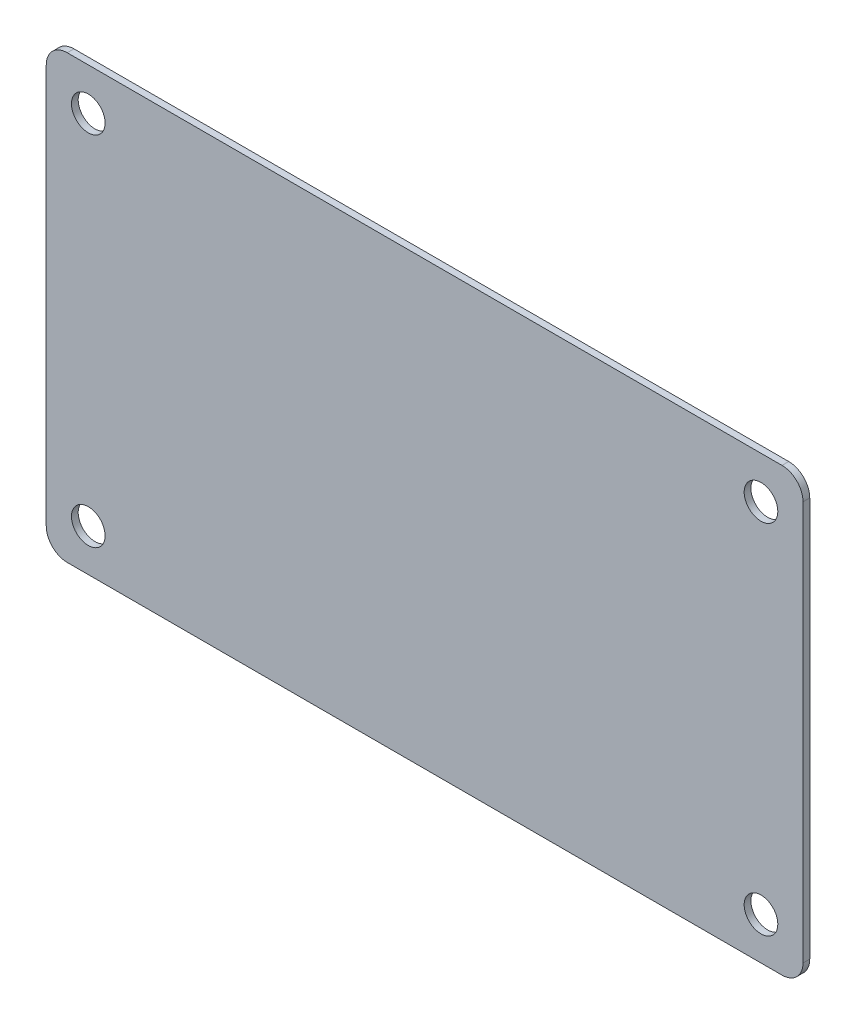
ISO-10303-21;
HEADER;
FILE_DESCRIPTION(('STEP AP214'),'2;1');
FILE_NAME('part.step','',(''),(''),'','','');
FILE_SCHEMA(('AUTOMOTIVE_DESIGN { 1 0 10303 214 1 1 1 1 }'));
ENDSEC;
DATA;
#1=APPLICATION_CONTEXT('core data for automotive mechanical design processes');
#2=APPLICATION_PROTOCOL_DEFINITION('international standard','automotive_design',2000,#1);
#3=PRODUCT_CONTEXT('',#1,'mechanical');
#4=PRODUCT('Part','Part','',(#3));
#5=PRODUCT_RELATED_PRODUCT_CATEGORY('part','',(#4));
#6=PRODUCT_DEFINITION_FORMATION('','',#4);
#7=PRODUCT_DEFINITION_CONTEXT('part definition',#1,'design');
#8=PRODUCT_DEFINITION('design','',#6,#7);
#9=PRODUCT_DEFINITION_SHAPE('','',#8);
#10=(LENGTH_UNIT() NAMED_UNIT(*) SI_UNIT(.MILLI.,.METRE.));
#11=(NAMED_UNIT(*) PLANE_ANGLE_UNIT() SI_UNIT($,.RADIAN.));
#12=(NAMED_UNIT(*) SI_UNIT($,.STERADIAN.) SOLID_ANGLE_UNIT());
#13=UNCERTAINTY_MEASURE_WITH_UNIT(LENGTH_MEASURE(1.E-05),#10,'distance_accuracy_value','');
#14=(GEOMETRIC_REPRESENTATION_CONTEXT(3) GLOBAL_UNCERTAINTY_ASSIGNED_CONTEXT((#13)) GLOBAL_UNIT_ASSIGNED_CONTEXT((#10,
#11,#12)) REPRESENTATION_CONTEXT('',''));
#15=CARTESIAN_POINT('',(0.,0.,0.));
#16=DIRECTION('',(0.,0.,1.));
#17=DIRECTION('',(1.,0.,0.));
#18=AXIS2_PLACEMENT_3D('',#15,#16,#17);
#19=CARTESIAN_POINT('',(5.,100.,1.6));
#20=DIRECTION('',(0.,0.,-1.));
#21=DIRECTION('',(-1.,0.,0.));
#22=AXIS2_PLACEMENT_3D('',#19,#20,#21);
#23=CYLINDRICAL_SURFACE('',#22,5.);
#24=CARTESIAN_POINT('',(5.,100.,0.));
#25=DIRECTION('',(0.,0.,1.));
#26=DIRECTION('',(-1.,0.,0.));
#27=AXIS2_PLACEMENT_3D('',#24,#25,#26);
#28=CIRCLE('',#27,5.);
#29=CARTESIAN_POINT('',(5.00000000000003,105.,0.));
#30=VERTEX_POINT('',#29);
#31=CARTESIAN_POINT('',(0.,100.,0.));
#32=VERTEX_POINT('',#31);
#33=EDGE_CURVE('E137',#30,#32,#28,.T.);
#34=ORIENTED_EDGE('',*,*,#33,.T.);
#35=DIRECTION('',(0.,0.,-1.));
#36=VECTOR('',#35,1.);
#37=CARTESIAN_POINT('',(0.,100.,1.6));
#38=LINE('',#37,#36);
#39=CARTESIAN_POINT('',(0.,100.,1.6));
#40=VERTEX_POINT('',#39);
#41=EDGE_CURVE('E11',#40,#32,#38,.T.);
#42=ORIENTED_EDGE('',*,*,#41,.F.);
#43=CARTESIAN_POINT('',(5.,100.,1.6));
#44=DIRECTION('',(0.,0.,1.));
#45=DIRECTION('',(-1.,0.,0.));
#46=AXIS2_PLACEMENT_3D('',#43,#44,#45);
#47=CIRCLE('',#46,5.);
#48=CARTESIAN_POINT('',(5.00000000000003,105.,1.6));
#49=VERTEX_POINT('',#48);
#50=EDGE_CURVE('E151',#49,#40,#47,.T.);
#51=ORIENTED_EDGE('',*,*,#50,.F.);
#52=DIRECTION('',(0.,0.,-1.));
#53=VECTOR('',#52,1.);
#54=CARTESIAN_POINT('',(5.00000000000003,105.,1.6));
#55=LINE('',#54,#53);
#56=EDGE_CURVE('E133',#49,#30,#55,.T.);
#57=ORIENTED_EDGE('',*,*,#56,.T.);
#58=EDGE_LOOP('',(#34,#42,#51,#57));
#59=FACE_BOUND('',#58,.T.);
#60=ADVANCED_FACE('F39',(#59),#23,.T.);
#61=CARTESIAN_POINT('',(0.,5.00000000000004,1.6));
#62=DIRECTION('',(1.,0.,0.));
#63=DIRECTION('',(0.,0.,-1.));
#64=AXIS2_PLACEMENT_3D('',#61,#62,#63);
#65=PLANE('',#64);
#66=DIRECTION('',(0.,-1.,0.));
#67=VECTOR('',#66,1.);
#68=CARTESIAN_POINT('',(0.,5.00000000000004,0.));
#69=LINE('',#68,#67);
#70=CARTESIAN_POINT('',(0.,5.00000000000004,0.));
#71=VERTEX_POINT('',#70);
#72=EDGE_CURVE('E140',#32,#71,#69,.T.);
#73=ORIENTED_EDGE('',*,*,#72,.T.);
#74=DIRECTION('',(0.,0.,-1.));
#75=VECTOR('',#74,1.);
#76=CARTESIAN_POINT('',(0.,5.00000000000004,1.6));
#77=LINE('',#76,#75);
#78=CARTESIAN_POINT('',(0.,5.00000000000004,1.6));
#79=VERTEX_POINT('',#78);
#80=EDGE_CURVE('E48',#79,#71,#77,.T.);
#81=ORIENTED_EDGE('',*,*,#80,.F.);
#82=DIRECTION('',(0.,-1.,0.));
#83=VECTOR('',#82,1.);
#84=CARTESIAN_POINT('',(0.,5.00000000000004,1.6));
#85=LINE('',#84,#83);
#86=EDGE_CURVE('E100',#40,#79,#85,.T.);
#87=ORIENTED_EDGE('',*,*,#86,.F.);
#88=ORIENTED_EDGE('',*,*,#41,.T.);
#89=EDGE_LOOP('',(#73,#81,#87,#88));
#90=FACE_BOUND('',#89,.T.);
#91=ADVANCED_FACE('F205',(#90),#65,.F.);
#92=CARTESIAN_POINT('',(5.,5.,1.6));
#93=DIRECTION('',(0.,0.,-1.));
#94=DIRECTION('',(-1.,0.,0.));
#95=AXIS2_PLACEMENT_3D('',#92,#93,#94);
#96=CYLINDRICAL_SURFACE('',#95,5.);
#97=CARTESIAN_POINT('',(5.,5.,0.));
#98=DIRECTION('',(0.,0.,1.));
#99=DIRECTION('',(-1.,0.,0.));
#100=AXIS2_PLACEMENT_3D('',#97,#98,#99);
#101=CIRCLE('',#100,5.);
#102=CARTESIAN_POINT('',(5.00000000000004,0.,0.));
#103=VERTEX_POINT('',#102);
#104=EDGE_CURVE('E142',#71,#103,#101,.T.);
#105=ORIENTED_EDGE('',*,*,#104,.T.);
#106=DIRECTION('',(0.,0.,-1.));
#107=VECTOR('',#106,1.);
#108=CARTESIAN_POINT('',(5.00000000000004,0.,1.6));
#109=LINE('',#108,#107);
#110=CARTESIAN_POINT('',(5.00000000000004,0.,1.6));
#111=VERTEX_POINT('',#110);
#112=EDGE_CURVE('E158',#111,#103,#109,.T.);
#113=ORIENTED_EDGE('',*,*,#112,.F.);
#114=CARTESIAN_POINT('',(5.,5.,1.6));
#115=DIRECTION('',(0.,0.,1.));
#116=DIRECTION('',(-1.,0.,0.));
#117=AXIS2_PLACEMENT_3D('',#114,#115,#116);
#118=CIRCLE('',#117,5.);
#119=EDGE_CURVE('E360',#79,#111,#118,.T.);
#120=ORIENTED_EDGE('',*,*,#119,.F.);
#121=ORIENTED_EDGE('',*,*,#80,.T.);
#122=EDGE_LOOP('',(#105,#113,#120,#121));
#123=FACE_BOUND('',#122,.T.);
#124=ADVANCED_FACE('F209',(#123),#96,.T.);
#125=CARTESIAN_POINT('',(5.00000000000004,0.,1.6));
#126=DIRECTION('',(0.,1.,0.));
#127=DIRECTION('',(0.,0.,1.));
#128=AXIS2_PLACEMENT_3D('',#125,#126,#127);
#129=PLANE('',#128);
#130=DIRECTION('',(1.,0.,0.));
#131=VECTOR('',#130,1.);
#132=CARTESIAN_POINT('',(5.00000000000004,0.,0.));
#133=LINE('',#132,#131);
#134=CARTESIAN_POINT('',(175.,0.,0.));
#135=VERTEX_POINT('',#134);
#136=EDGE_CURVE('E144',#103,#135,#133,.T.);
#137=ORIENTED_EDGE('',*,*,#136,.T.);
#138=DIRECTION('',(0.,0.,-1.));
#139=VECTOR('',#138,1.);
#140=CARTESIAN_POINT('',(175.,0.,1.6));
#141=LINE('',#140,#139);
#142=CARTESIAN_POINT('',(175.,0.,1.6));
#143=VERTEX_POINT('',#142);
#144=EDGE_CURVE('E155',#143,#135,#141,.T.);
#145=ORIENTED_EDGE('',*,*,#144,.F.);
#146=DIRECTION('',(1.,0.,0.));
#147=VECTOR('',#146,1.);
#148=CARTESIAN_POINT('',(5.00000000000004,0.,1.6));
#149=LINE('',#148,#147);
#150=EDGE_CURVE('E362',#111,#143,#149,.T.);
#151=ORIENTED_EDGE('',*,*,#150,.F.);
#152=ORIENTED_EDGE('',*,*,#112,.T.);
#153=EDGE_LOOP('',(#137,#145,#151,#152));
#154=FACE_BOUND('',#153,.T.);
#155=ADVANCED_FACE('F213',(#154),#129,.F.);
#156=CARTESIAN_POINT('',(175.,5.,1.6));
#157=DIRECTION('',(0.,0.,-1.));
#158=DIRECTION('',(-1.,0.,0.));
#159=AXIS2_PLACEMENT_3D('',#156,#157,#158);
#160=CYLINDRICAL_SURFACE('',#159,5.);
#161=CARTESIAN_POINT('',(175.,5.,0.));
#162=DIRECTION('',(0.,0.,1.));
#163=DIRECTION('',(1.,0.,0.));
#164=AXIS2_PLACEMENT_3D('',#161,#162,#163);
#165=CIRCLE('',#164,5.);
#166=CARTESIAN_POINT('',(180.,5.,0.));
#167=VERTEX_POINT('',#166);
#168=EDGE_CURVE('E146',#135,#167,#165,.T.);
#169=ORIENTED_EDGE('',*,*,#168,.T.);
#170=DIRECTION('',(0.,0.,-1.));
#171=VECTOR('',#170,1.);
#172=CARTESIAN_POINT('',(180.,5.,1.6));
#173=LINE('',#172,#171);
#174=CARTESIAN_POINT('',(180.,5.,1.6));
#175=VERTEX_POINT('',#174);
#176=EDGE_CURVE('E128',#175,#167,#173,.T.);
#177=ORIENTED_EDGE('',*,*,#176,.F.);
#178=CARTESIAN_POINT('',(175.,5.,1.6));
#179=DIRECTION('',(0.,0.,1.));
#180=DIRECTION('',(1.,0.,0.));
#181=AXIS2_PLACEMENT_3D('',#178,#179,#180);
#182=CIRCLE('',#181,5.);
#183=EDGE_CURVE('E119',#143,#175,#182,.T.);
#184=ORIENTED_EDGE('',*,*,#183,.F.);
#185=ORIENTED_EDGE('',*,*,#144,.T.);
#186=EDGE_LOOP('',(#169,#177,#184,#185));
#187=FACE_BOUND('',#186,.T.);
#188=ADVANCED_FACE('F219',(#187),#160,.T.);
#189=CARTESIAN_POINT('',(180.,5.00000000000004,1.6));
#190=DIRECTION('',(-1.,0.,0.));
#191=DIRECTION('',(0.,0.,1.));
#192=AXIS2_PLACEMENT_3D('',#189,#190,#191);
#193=PLANE('',#192);
#194=DIRECTION('',(0.,1.,0.));
#195=VECTOR('',#194,1.);
#196=CARTESIAN_POINT('',(180.,5.00000000000004,0.));
#197=LINE('',#196,#195);
#198=CARTESIAN_POINT('',(180.,100.,0.));
#199=VERTEX_POINT('',#198);
#200=EDGE_CURVE('E127',#167,#199,#197,.T.);
#201=ORIENTED_EDGE('',*,*,#200,.T.);
#202=DIRECTION('',(0.,0.,-1.));
#203=VECTOR('',#202,1.);
#204=CARTESIAN_POINT('',(180.,100.,1.6));
#205=LINE('',#204,#203);
#206=CARTESIAN_POINT('',(180.,100.,1.6));
#207=VERTEX_POINT('',#206);
#208=EDGE_CURVE('E124',#207,#199,#205,.T.);
#209=ORIENTED_EDGE('',*,*,#208,.F.);
#210=DIRECTION('',(0.,1.,0.));
#211=VECTOR('',#210,1.);
#212=CARTESIAN_POINT('',(180.,5.00000000000004,1.6));
#213=LINE('',#212,#211);
#214=EDGE_CURVE('E113',#175,#207,#213,.T.);
#215=ORIENTED_EDGE('',*,*,#214,.F.);
#216=ORIENTED_EDGE('',*,*,#176,.T.);
#217=EDGE_LOOP('',(#201,#209,#215,#216));
#218=FACE_BOUND('',#217,.T.);
#219=ADVANCED_FACE('F125',(#218),#193,.F.);
#220=CARTESIAN_POINT('',(175.,100.,1.6));
#221=DIRECTION('',(0.,0.,-1.));
#222=DIRECTION('',(-1.,0.,0.));
#223=AXIS2_PLACEMENT_3D('',#220,#221,#222);
#224=CYLINDRICAL_SURFACE('',#223,5.);
#225=CARTESIAN_POINT('',(175.,100.,0.));
#226=DIRECTION('',(0.,0.,1.));
#227=DIRECTION('',(-1.,0.,0.));
#228=AXIS2_PLACEMENT_3D('',#225,#226,#227);
#229=CIRCLE('',#228,5.);
#230=CARTESIAN_POINT('',(175.,105.,0.));
#231=VERTEX_POINT('',#230);
#232=EDGE_CURVE('E86',#199,#231,#229,.T.);
#233=ORIENTED_EDGE('',*,*,#232,.T.);
#234=DIRECTION('',(0.,0.,-1.));
#235=VECTOR('',#234,1.);
#236=CARTESIAN_POINT('',(175.,105.,1.6));
#237=LINE('',#236,#235);
#238=CARTESIAN_POINT('',(175.,105.,1.6));
#239=VERTEX_POINT('',#238);
#240=EDGE_CURVE('E129',#239,#231,#237,.T.);
#241=ORIENTED_EDGE('',*,*,#240,.F.);
#242=CARTESIAN_POINT('',(175.,100.,1.6));
#243=DIRECTION('',(0.,0.,1.));
#244=DIRECTION('',(-1.,0.,0.));
#245=AXIS2_PLACEMENT_3D('',#242,#243,#244);
#246=CIRCLE('',#245,5.);
#247=EDGE_CURVE('E117',#207,#239,#246,.T.);
#248=ORIENTED_EDGE('',*,*,#247,.F.);
#249=ORIENTED_EDGE('',*,*,#208,.T.);
#250=EDGE_LOOP('',(#233,#241,#248,#249));
#251=FACE_BOUND('',#250,.T.);
#252=ADVANCED_FACE('F131',(#251),#224,.T.);
#253=CARTESIAN_POINT('',(5.00000000000003,105.,1.6));
#254=DIRECTION('',(0.,-1.,0.));
#255=DIRECTION('',(0.,0.,-1.));
#256=AXIS2_PLACEMENT_3D('',#253,#254,#255);
#257=PLANE('',#256);
#258=DIRECTION('',(-1.,0.,0.));
#259=VECTOR('',#258,1.);
#260=CARTESIAN_POINT('',(5.00000000000003,105.,0.));
#261=LINE('',#260,#259);
#262=EDGE_CURVE('E92',#231,#30,#261,.T.);
#263=ORIENTED_EDGE('',*,*,#262,.T.);
#264=ORIENTED_EDGE('',*,*,#56,.F.);
#265=DIRECTION('',(-1.,0.,0.));
#266=VECTOR('',#265,1.);
#267=CARTESIAN_POINT('',(5.00000000000003,105.,1.6));
#268=LINE('',#267,#266);
#269=EDGE_CURVE('E57',#239,#49,#268,.T.);
#270=ORIENTED_EDGE('',*,*,#269,.F.);
#271=ORIENTED_EDGE('',*,*,#240,.T.);
#272=EDGE_LOOP('',(#263,#264,#270,#271));
#273=FACE_BOUND('',#272,.T.);
#274=ADVANCED_FACE('F194',(#273),#257,.F.);
#275=CARTESIAN_POINT('',(5.,100.,1.6));
#276=DIRECTION('',(0.,0.,-1.));
#277=DIRECTION('',(-1.,0.,0.));
#278=AXIS2_PLACEMENT_3D('',#275,#276,#277);
#279=PLANE('',#278);
#280=CARTESIAN_POINT('',(10.,95.,1.6));
#281=DIRECTION('',(0.,0.,1.));
#282=DIRECTION('',(1.,0.,0.));
#283=AXIS2_PLACEMENT_3D('',#280,#281,#282);
#284=CIRCLE('',#283,4.);
#285=CARTESIAN_POINT('',(14.,95.,1.6));
#286=VERTEX_POINT('',#285);
#287=EDGE_CURVE('E348',#286,#286,#284,.T.);
#288=ORIENTED_EDGE('',*,*,#287,.F.);
#289=EDGE_LOOP('',(#288));
#290=FACE_BOUND('',#289,.T.);
#291=CARTESIAN_POINT('',(170.,10.,1.6));
#292=DIRECTION('',(0.,0.,1.));
#293=DIRECTION('',(1.,0.,0.));
#294=AXIS2_PLACEMENT_3D('',#291,#292,#293);
#295=CIRCLE('',#294,4.);
#296=CARTESIAN_POINT('',(174.,10.,1.6));
#297=VERTEX_POINT('',#296);
#298=EDGE_CURVE('E346',#297,#297,#295,.T.);
#299=ORIENTED_EDGE('',*,*,#298,.F.);
#300=EDGE_LOOP('',(#299));
#301=FACE_BOUND('',#300,.T.);
#302=CARTESIAN_POINT('',(170.,95.,1.6));
#303=DIRECTION('',(0.,0.,1.));
#304=DIRECTION('',(1.,0.,0.));
#305=AXIS2_PLACEMENT_3D('',#302,#303,#304);
#306=CIRCLE('',#305,4.);
#307=CARTESIAN_POINT('',(174.,95.,1.6));
#308=VERTEX_POINT('',#307);
#309=EDGE_CURVE('E349',#308,#308,#306,.T.);
#310=ORIENTED_EDGE('',*,*,#309,.F.);
#311=EDGE_LOOP('',(#310));
#312=FACE_BOUND('',#311,.T.);
#313=CARTESIAN_POINT('',(10.,10.,1.6));
#314=DIRECTION('',(0.,0.,1.));
#315=DIRECTION('',(1.,0.,0.));
#316=AXIS2_PLACEMENT_3D('',#313,#314,#315);
#317=CIRCLE('',#316,4.);
#318=CARTESIAN_POINT('',(14.,10.,1.6));
#319=VERTEX_POINT('',#318);
#320=EDGE_CURVE('E167',#319,#319,#317,.T.);
#321=ORIENTED_EDGE('',*,*,#320,.F.);
#322=EDGE_LOOP('',(#321));
#323=FACE_BOUND('',#322,.T.);
#324=ORIENTED_EDGE('',*,*,#50,.T.);
#325=ORIENTED_EDGE('',*,*,#86,.T.);
#326=ORIENTED_EDGE('',*,*,#119,.T.);
#327=ORIENTED_EDGE('',*,*,#150,.T.);
#328=ORIENTED_EDGE('',*,*,#183,.T.);
#329=ORIENTED_EDGE('',*,*,#214,.T.);
#330=ORIENTED_EDGE('',*,*,#247,.T.);
#331=ORIENTED_EDGE('',*,*,#269,.T.);
#332=EDGE_LOOP('',(#324,#325,#326,#327,#328,#329,#330,#331));
#333=FACE_BOUND('',#332,.T.);
#334=ADVANCED_FACE('F115',(#290,#301,#312,#323,#333),#279,.F.);
#335=CARTESIAN_POINT('',(5.,100.,0.));
#336=DIRECTION('',(0.,0.,-1.));
#337=DIRECTION('',(-1.,0.,0.));
#338=AXIS2_PLACEMENT_3D('',#335,#336,#337);
#339=PLANE('',#338);
#340=CARTESIAN_POINT('',(10.,95.,0.));
#341=DIRECTION('',(0.,0.,-1.));
#342=DIRECTION('',(-1.,0.,0.));
#343=AXIS2_PLACEMENT_3D('',#340,#341,#342);
#344=CIRCLE('',#343,4.);
#345=CARTESIAN_POINT('',(14.,95.,0.));
#346=VERTEX_POINT('',#345);
#347=EDGE_CURVE('E42',#346,#346,#344,.T.);
#348=ORIENTED_EDGE('',*,*,#347,.F.);
#349=EDGE_LOOP('',(#348));
#350=FACE_BOUND('',#349,.T.);
#351=CARTESIAN_POINT('',(170.,10.,0.));
#352=DIRECTION('',(0.,0.,-1.));
#353=DIRECTION('',(-1.,0.,0.));
#354=AXIS2_PLACEMENT_3D('',#351,#352,#353);
#355=CIRCLE('',#354,4.);
#356=CARTESIAN_POINT('',(174.,10.,0.));
#357=VERTEX_POINT('',#356);
#358=EDGE_CURVE('E169',#357,#357,#355,.T.);
#359=ORIENTED_EDGE('',*,*,#358,.F.);
#360=EDGE_LOOP('',(#359));
#361=FACE_BOUND('',#360,.T.);
#362=CARTESIAN_POINT('',(170.,95.,0.));
#363=DIRECTION('',(0.,0.,-1.));
#364=DIRECTION('',(-1.,0.,0.));
#365=AXIS2_PLACEMENT_3D('',#362,#363,#364);
#366=CIRCLE('',#365,4.);
#367=CARTESIAN_POINT('',(174.,95.,0.));
#368=VERTEX_POINT('',#367);
#369=EDGE_CURVE('E166',#368,#368,#366,.T.);
#370=ORIENTED_EDGE('',*,*,#369,.F.);
#371=EDGE_LOOP('',(#370));
#372=FACE_BOUND('',#371,.T.);
#373=CARTESIAN_POINT('',(10.,10.,0.));
#374=DIRECTION('',(0.,0.,-1.));
#375=DIRECTION('',(-1.,0.,0.));
#376=AXIS2_PLACEMENT_3D('',#373,#374,#375);
#377=CIRCLE('',#376,4.);
#378=CARTESIAN_POINT('',(14.,10.,0.));
#379=VERTEX_POINT('',#378);
#380=EDGE_CURVE('E163',#379,#379,#377,.T.);
#381=ORIENTED_EDGE('',*,*,#380,.F.);
#382=EDGE_LOOP('',(#381));
#383=FACE_BOUND('',#382,.T.);
#384=ORIENTED_EDGE('',*,*,#33,.F.);
#385=ORIENTED_EDGE('',*,*,#262,.F.);
#386=ORIENTED_EDGE('',*,*,#232,.F.);
#387=ORIENTED_EDGE('',*,*,#200,.F.);
#388=ORIENTED_EDGE('',*,*,#168,.F.);
#389=ORIENTED_EDGE('',*,*,#136,.F.);
#390=ORIENTED_EDGE('',*,*,#104,.F.);
#391=ORIENTED_EDGE('',*,*,#72,.F.);
#392=EDGE_LOOP('',(#384,#385,#386,#387,#388,#389,#390,#391));
#393=FACE_BOUND('',#392,.T.);
#394=ADVANCED_FACE('F179',(#350,#361,#372,#383,#393),#339,.T.);
#395=CARTESIAN_POINT('',(10.,10.,-1.2E-05));
#396=DIRECTION('',(0.,0.,1.));
#397=DIRECTION('',(1.,0.,0.));
#398=AXIS2_PLACEMENT_3D('',#395,#396,#397);
#399=CYLINDRICAL_SURFACE('',#398,4.);
#400=CARTESIAN_POINT('',(14.,10.,0.));
#401=CARTESIAN_POINT('',(14.,10.,0.0166666666666667));
#402=CARTESIAN_POINT('',(14.,10.,0.0333333333333333));
#403=CARTESIAN_POINT('',(14.,10.,0.0666666666666667));
#404=CARTESIAN_POINT('',(14.,10.,0.0833333333333333));
#405=CARTESIAN_POINT('',(14.,10.,0.116666666666667));
#406=CARTESIAN_POINT('',(14.,10.,0.133333333333333));
#407=CARTESIAN_POINT('',(14.,10.,0.166666666666667));
#408=CARTESIAN_POINT('',(14.,10.,0.183333333333333));
#409=CARTESIAN_POINT('',(14.,10.,0.216666666666667));
#410=CARTESIAN_POINT('',(14.,10.,0.233333333333333));
#411=CARTESIAN_POINT('',(14.,10.,0.266666666666667));
#412=CARTESIAN_POINT('',(14.,10.,0.283333333333333));
#413=CARTESIAN_POINT('',(14.,10.,0.316666666666667));
#414=CARTESIAN_POINT('',(14.,10.,0.333333333333333));
#415=CARTESIAN_POINT('',(14.,10.,0.366666666666667));
#416=CARTESIAN_POINT('',(14.,10.,0.383333333333333));
#417=CARTESIAN_POINT('',(14.,10.,0.416666666666667));
#418=CARTESIAN_POINT('',(14.,10.,0.433333333333333));
#419=CARTESIAN_POINT('',(14.,10.,0.466666666666667));
#420=CARTESIAN_POINT('',(14.,10.,0.483333333333333));
#421=CARTESIAN_POINT('',(14.,10.,0.516666666666667));
#422=CARTESIAN_POINT('',(14.,10.,0.533333333333333));
#423=CARTESIAN_POINT('',(14.,10.,0.566666666666667));
#424=CARTESIAN_POINT('',(14.,10.,0.583333333333333));
#425=CARTESIAN_POINT('',(14.,10.,0.616666666666667));
#426=CARTESIAN_POINT('',(14.,10.,0.633333333333333));
#427=CARTESIAN_POINT('',(14.,10.,0.666666666666667));
#428=CARTESIAN_POINT('',(14.,10.,0.683333333333333));
#429=CARTESIAN_POINT('',(14.,10.,0.716666666666667));
#430=CARTESIAN_POINT('',(14.,10.,0.733333333333333));
#431=CARTESIAN_POINT('',(14.,10.,0.766666666666667));
#432=CARTESIAN_POINT('',(14.,10.,0.783333333333333));
#433=CARTESIAN_POINT('',(14.,10.,0.816666666666667));
#434=CARTESIAN_POINT('',(14.,10.,0.833333333333333));
#435=CARTESIAN_POINT('',(14.,10.,0.866666666666667));
#436=CARTESIAN_POINT('',(14.,10.,0.883333333333333));
#437=CARTESIAN_POINT('',(14.,10.,0.916666666666667));
#438=CARTESIAN_POINT('',(14.,10.,0.933333333333333));
#439=CARTESIAN_POINT('',(14.,10.,0.966666666666667));
#440=CARTESIAN_POINT('',(14.,10.,0.983333333333333));
#441=CARTESIAN_POINT('',(14.,10.,1.01666666666667));
#442=CARTESIAN_POINT('',(14.,10.,1.03333333333333));
#443=CARTESIAN_POINT('',(14.,10.,1.06666666666667));
#444=CARTESIAN_POINT('',(14.,10.,1.08333333333333));
#445=CARTESIAN_POINT('',(14.,10.,1.11666666666667));
#446=CARTESIAN_POINT('',(14.,10.,1.13333333333333));
#447=CARTESIAN_POINT('',(14.,10.,1.16666666666667));
#448=CARTESIAN_POINT('',(14.,10.,1.18333333333333));
#449=CARTESIAN_POINT('',(14.,10.,1.21666666666667));
#450=CARTESIAN_POINT('',(14.,10.,1.23333333333333));
#451=CARTESIAN_POINT('',(14.,10.,1.26666666666667));
#452=CARTESIAN_POINT('',(14.,10.,1.28333333333333));
#453=CARTESIAN_POINT('',(14.,10.,1.31666666666667));
#454=CARTESIAN_POINT('',(14.,10.,1.33333333333333));
#455=CARTESIAN_POINT('',(14.,10.,1.36666666666667));
#456=CARTESIAN_POINT('',(14.,10.,1.38333333333333));
#457=CARTESIAN_POINT('',(14.,10.,1.41666666666667));
#458=CARTESIAN_POINT('',(14.,10.,1.43333333333333));
#459=CARTESIAN_POINT('',(14.,10.,1.46666666666667));
#460=CARTESIAN_POINT('',(14.,10.,1.48333333333333));
#461=CARTESIAN_POINT('',(14.,10.,1.51666666666667));
#462=CARTESIAN_POINT('',(14.,10.,1.53333333333333));
#463=CARTESIAN_POINT('',(14.,10.,1.56666666666667));
#464=CARTESIAN_POINT('',(14.,10.,1.58333333333333));
#465=CARTESIAN_POINT('',(14.,10.,1.6));
#466=B_SPLINE_CURVE_WITH_KNOTS('',3,(#400,#401,#402,#403,#404,#405,#406,#407,#408,#409,#410,
#411,#412,#413,#414,#415,#416,#417,#418,#419,#420,#421,#422,#423,#424,#425,#426,#427,#428,#429,
#430,#431,#432,#433,#434,#435,#436,#437,#438,#439,#440,#441,#442,#443,#444,#445,#446,#447,#448,
#449,#450,#451,#452,#453,#454,#455,#456,#457,#458,#459,#460,#461,#462,#463,#464,#465),
.UNSPECIFIED.,.F.,.F.,(4,2,2,2,2,2,2,2,2,2,2,2,2,2,2,2,2,2,2,2,2,2,2,2,2,2,2,2,2,2,2,2,4),(0.,
0.05,0.1,0.15,0.2,0.25,0.3,0.35,0.4,0.45,0.5,0.55,0.6,0.65,0.7,0.75,0.8,0.85,0.9,0.95,1.,1.05,
1.1,1.15,1.2,1.25,1.3,1.35,1.4,1.45,1.5,1.55,1.6),.UNSPECIFIED.);
#467=EDGE_CURVE('BSEAM182',#379,#319,#466,.T.);
#468=ORIENTED_EDGE('',*,*,#380,.T.);
#469=ORIENTED_EDGE('',*,*,#320,.T.);
#470=ORIENTED_EDGE('',*,*,#467,.T.);
#471=ORIENTED_EDGE('',*,*,#467,.F.);
#472=EDGE_LOOP('',(#468,#470,#469,#471));
#473=FACE_BOUND('',#472,.T.);
#474=ADVANCED_FACE('F182',(#473),#399,.F.);
#475=CARTESIAN_POINT('',(170.,95.,-1.2E-05));
#476=DIRECTION('',(0.,0.,1.));
#477=DIRECTION('',(1.,0.,0.));
#478=AXIS2_PLACEMENT_3D('',#475,#476,#477);
#479=CYLINDRICAL_SURFACE('',#478,4.);
#480=CARTESIAN_POINT('',(174.,95.,0.));
#481=CARTESIAN_POINT('',(174.,95.,0.0166666666666667));
#482=CARTESIAN_POINT('',(174.,95.,0.0333333333333333));
#483=CARTESIAN_POINT('',(174.,95.,0.0666666666666667));
#484=CARTESIAN_POINT('',(174.,95.,0.0833333333333333));
#485=CARTESIAN_POINT('',(174.,95.,0.116666666666667));
#486=CARTESIAN_POINT('',(174.,95.,0.133333333333333));
#487=CARTESIAN_POINT('',(174.,95.,0.166666666666667));
#488=CARTESIAN_POINT('',(174.,95.,0.183333333333333));
#489=CARTESIAN_POINT('',(174.,95.,0.216666666666667));
#490=CARTESIAN_POINT('',(174.,95.,0.233333333333333));
#491=CARTESIAN_POINT('',(174.,95.,0.266666666666667));
#492=CARTESIAN_POINT('',(174.,95.,0.283333333333333));
#493=CARTESIAN_POINT('',(174.,95.,0.316666666666667));
#494=CARTESIAN_POINT('',(174.,95.,0.333333333333333));
#495=CARTESIAN_POINT('',(174.,95.,0.366666666666667));
#496=CARTESIAN_POINT('',(174.,95.,0.383333333333333));
#497=CARTESIAN_POINT('',(174.,95.,0.416666666666667));
#498=CARTESIAN_POINT('',(174.,95.,0.433333333333333));
#499=CARTESIAN_POINT('',(174.,95.,0.466666666666667));
#500=CARTESIAN_POINT('',(174.,95.,0.483333333333333));
#501=CARTESIAN_POINT('',(174.,95.,0.516666666666667));
#502=CARTESIAN_POINT('',(174.,95.,0.533333333333333));
#503=CARTESIAN_POINT('',(174.,95.,0.566666666666667));
#504=CARTESIAN_POINT('',(174.,95.,0.583333333333333));
#505=CARTESIAN_POINT('',(174.,95.,0.616666666666667));
#506=CARTESIAN_POINT('',(174.,95.,0.633333333333333));
#507=CARTESIAN_POINT('',(174.,95.,0.666666666666667));
#508=CARTESIAN_POINT('',(174.,95.,0.683333333333333));
#509=CARTESIAN_POINT('',(174.,95.,0.716666666666667));
#510=CARTESIAN_POINT('',(174.,95.,0.733333333333333));
#511=CARTESIAN_POINT('',(174.,95.,0.766666666666667));
#512=CARTESIAN_POINT('',(174.,95.,0.783333333333333));
#513=CARTESIAN_POINT('',(174.,95.,0.816666666666667));
#514=CARTESIAN_POINT('',(174.,95.,0.833333333333333));
#515=CARTESIAN_POINT('',(174.,95.,0.866666666666667));
#516=CARTESIAN_POINT('',(174.,95.,0.883333333333333));
#517=CARTESIAN_POINT('',(174.,95.,0.916666666666667));
#518=CARTESIAN_POINT('',(174.,95.,0.933333333333333));
#519=CARTESIAN_POINT('',(174.,95.,0.966666666666667));
#520=CARTESIAN_POINT('',(174.,95.,0.983333333333333));
#521=CARTESIAN_POINT('',(174.,95.,1.01666666666667));
#522=CARTESIAN_POINT('',(174.,95.,1.03333333333333));
#523=CARTESIAN_POINT('',(174.,95.,1.06666666666667));
#524=CARTESIAN_POINT('',(174.,95.,1.08333333333333));
#525=CARTESIAN_POINT('',(174.,95.,1.11666666666667));
#526=CARTESIAN_POINT('',(174.,95.,1.13333333333333));
#527=CARTESIAN_POINT('',(174.,95.,1.16666666666667));
#528=CARTESIAN_POINT('',(174.,95.,1.18333333333333));
#529=CARTESIAN_POINT('',(174.,95.,1.21666666666667));
#530=CARTESIAN_POINT('',(174.,95.,1.23333333333333));
#531=CARTESIAN_POINT('',(174.,95.,1.26666666666667));
#532=CARTESIAN_POINT('',(174.,95.,1.28333333333333));
#533=CARTESIAN_POINT('',(174.,95.,1.31666666666667));
#534=CARTESIAN_POINT('',(174.,95.,1.33333333333333));
#535=CARTESIAN_POINT('',(174.,95.,1.36666666666667));
#536=CARTESIAN_POINT('',(174.,95.,1.38333333333333));
#537=CARTESIAN_POINT('',(174.,95.,1.41666666666667));
#538=CARTESIAN_POINT('',(174.,95.,1.43333333333333));
#539=CARTESIAN_POINT('',(174.,95.,1.46666666666667));
#540=CARTESIAN_POINT('',(174.,95.,1.48333333333333));
#541=CARTESIAN_POINT('',(174.,95.,1.51666666666667));
#542=CARTESIAN_POINT('',(174.,95.,1.53333333333333));
#543=CARTESIAN_POINT('',(174.,95.,1.56666666666667));
#544=CARTESIAN_POINT('',(174.,95.,1.58333333333333));
#545=CARTESIAN_POINT('',(174.,95.,1.6));
#546=B_SPLINE_CURVE_WITH_KNOTS('',3,(#480,#481,#482,#483,#484,#485,#486,#487,#488,#489,#490,
#491,#492,#493,#494,#495,#496,#497,#498,#499,#500,#501,#502,#503,#504,#505,#506,#507,#508,#509,
#510,#511,#512,#513,#514,#515,#516,#517,#518,#519,#520,#521,#522,#523,#524,#525,#526,#527,#528,
#529,#530,#531,#532,#533,#534,#535,#536,#537,#538,#539,#540,#541,#542,#543,#544,#545),
.UNSPECIFIED.,.F.,.F.,(4,2,2,2,2,2,2,2,2,2,2,2,2,2,2,2,2,2,2,2,2,2,2,2,2,2,2,2,2,2,2,2,4),(0.,
0.05,0.1,0.15,0.2,0.25,0.3,0.35,0.4,0.45,0.5,0.55,0.6,0.65,0.7,0.75,0.8,0.85,0.9,0.95,1.,1.05,
1.1,1.15,1.2,1.25,1.3,1.35,1.4,1.45,1.5,1.55,1.6),.UNSPECIFIED.);
#547=EDGE_CURVE('BSEAM262',#368,#308,#546,.T.);
#548=ORIENTED_EDGE('',*,*,#369,.T.);
#549=ORIENTED_EDGE('',*,*,#309,.T.);
#550=ORIENTED_EDGE('',*,*,#547,.T.);
#551=ORIENTED_EDGE('',*,*,#547,.F.);
#552=EDGE_LOOP('',(#548,#550,#549,#551));
#553=FACE_BOUND('',#552,.T.);
#554=ADVANCED_FACE('F262',(#553),#479,.F.);
#555=CARTESIAN_POINT('',(170.,10.,-1.2E-05));
#556=DIRECTION('',(0.,0.,1.));
#557=DIRECTION('',(1.,0.,0.));
#558=AXIS2_PLACEMENT_3D('',#555,#556,#557);
#559=CYLINDRICAL_SURFACE('',#558,4.);
#560=CARTESIAN_POINT('',(174.,10.,0.));
#561=CARTESIAN_POINT('',(174.,10.,0.0166666666666667));
#562=CARTESIAN_POINT('',(174.,10.,0.0333333333333333));
#563=CARTESIAN_POINT('',(174.,10.,0.0666666666666667));
#564=CARTESIAN_POINT('',(174.,10.,0.0833333333333333));
#565=CARTESIAN_POINT('',(174.,10.,0.116666666666667));
#566=CARTESIAN_POINT('',(174.,10.,0.133333333333333));
#567=CARTESIAN_POINT('',(174.,10.,0.166666666666667));
#568=CARTESIAN_POINT('',(174.,10.,0.183333333333333));
#569=CARTESIAN_POINT('',(174.,10.,0.216666666666667));
#570=CARTESIAN_POINT('',(174.,10.,0.233333333333333));
#571=CARTESIAN_POINT('',(174.,10.,0.266666666666667));
#572=CARTESIAN_POINT('',(174.,10.,0.283333333333333));
#573=CARTESIAN_POINT('',(174.,10.,0.316666666666667));
#574=CARTESIAN_POINT('',(174.,10.,0.333333333333333));
#575=CARTESIAN_POINT('',(174.,10.,0.366666666666667));
#576=CARTESIAN_POINT('',(174.,10.,0.383333333333333));
#577=CARTESIAN_POINT('',(174.,10.,0.416666666666667));
#578=CARTESIAN_POINT('',(174.,10.,0.433333333333333));
#579=CARTESIAN_POINT('',(174.,10.,0.466666666666667));
#580=CARTESIAN_POINT('',(174.,10.,0.483333333333333));
#581=CARTESIAN_POINT('',(174.,10.,0.516666666666667));
#582=CARTESIAN_POINT('',(174.,10.,0.533333333333333));
#583=CARTESIAN_POINT('',(174.,10.,0.566666666666667));
#584=CARTESIAN_POINT('',(174.,10.,0.583333333333333));
#585=CARTESIAN_POINT('',(174.,10.,0.616666666666667));
#586=CARTESIAN_POINT('',(174.,10.,0.633333333333333));
#587=CARTESIAN_POINT('',(174.,10.,0.666666666666667));
#588=CARTESIAN_POINT('',(174.,10.,0.683333333333333));
#589=CARTESIAN_POINT('',(174.,10.,0.716666666666667));
#590=CARTESIAN_POINT('',(174.,10.,0.733333333333333));
#591=CARTESIAN_POINT('',(174.,10.,0.766666666666667));
#592=CARTESIAN_POINT('',(174.,10.,0.783333333333333));
#593=CARTESIAN_POINT('',(174.,10.,0.816666666666667));
#594=CARTESIAN_POINT('',(174.,10.,0.833333333333333));
#595=CARTESIAN_POINT('',(174.,10.,0.866666666666667));
#596=CARTESIAN_POINT('',(174.,10.,0.883333333333333));
#597=CARTESIAN_POINT('',(174.,10.,0.916666666666667));
#598=CARTESIAN_POINT('',(174.,10.,0.933333333333333));
#599=CARTESIAN_POINT('',(174.,10.,0.966666666666667));
#600=CARTESIAN_POINT('',(174.,10.,0.983333333333333));
#601=CARTESIAN_POINT('',(174.,10.,1.01666666666667));
#602=CARTESIAN_POINT('',(174.,10.,1.03333333333333));
#603=CARTESIAN_POINT('',(174.,10.,1.06666666666667));
#604=CARTESIAN_POINT('',(174.,10.,1.08333333333333));
#605=CARTESIAN_POINT('',(174.,10.,1.11666666666667));
#606=CARTESIAN_POINT('',(174.,10.,1.13333333333333));
#607=CARTESIAN_POINT('',(174.,10.,1.16666666666667));
#608=CARTESIAN_POINT('',(174.,10.,1.18333333333333));
#609=CARTESIAN_POINT('',(174.,10.,1.21666666666667));
#610=CARTESIAN_POINT('',(174.,10.,1.23333333333333));
#611=CARTESIAN_POINT('',(174.,10.,1.26666666666667));
#612=CARTESIAN_POINT('',(174.,10.,1.28333333333333));
#613=CARTESIAN_POINT('',(174.,10.,1.31666666666667));
#614=CARTESIAN_POINT('',(174.,10.,1.33333333333333));
#615=CARTESIAN_POINT('',(174.,10.,1.36666666666667));
#616=CARTESIAN_POINT('',(174.,10.,1.38333333333333));
#617=CARTESIAN_POINT('',(174.,10.,1.41666666666667));
#618=CARTESIAN_POINT('',(174.,10.,1.43333333333333));
#619=CARTESIAN_POINT('',(174.,10.,1.46666666666667));
#620=CARTESIAN_POINT('',(174.,10.,1.48333333333333));
#621=CARTESIAN_POINT('',(174.,10.,1.51666666666667));
#622=CARTESIAN_POINT('',(174.,10.,1.53333333333333));
#623=CARTESIAN_POINT('',(174.,10.,1.56666666666667));
#624=CARTESIAN_POINT('',(174.,10.,1.58333333333333));
#625=CARTESIAN_POINT('',(174.,10.,1.6));
#626=B_SPLINE_CURVE_WITH_KNOTS('',3,(#560,#561,#562,#563,#564,#565,#566,#567,#568,#569,#570,
#571,#572,#573,#574,#575,#576,#577,#578,#579,#580,#581,#582,#583,#584,#585,#586,#587,#588,#589,
#590,#591,#592,#593,#594,#595,#596,#597,#598,#599,#600,#601,#602,#603,#604,#605,#606,#607,#608,
#609,#610,#611,#612,#613,#614,#615,#616,#617,#618,#619,#620,#621,#622,#623,#624,#625),
.UNSPECIFIED.,.F.,.F.,(4,2,2,2,2,2,2,2,2,2,2,2,2,2,2,2,2,2,2,2,2,2,2,2,2,2,2,2,2,2,2,2,4),(0.,
0.05,0.1,0.15,0.2,0.25,0.3,0.35,0.4,0.45,0.5,0.55,0.6,0.65,0.7,0.75,0.8,0.85,0.9,0.95,1.,1.05,
1.1,1.15,1.2,1.25,1.3,1.35,1.4,1.45,1.5,1.55,1.6),.UNSPECIFIED.);
#627=EDGE_CURVE('BSEAM273',#357,#297,#626,.T.);
#628=ORIENTED_EDGE('',*,*,#358,.T.);
#629=ORIENTED_EDGE('',*,*,#298,.T.);
#630=ORIENTED_EDGE('',*,*,#627,.T.);
#631=ORIENTED_EDGE('',*,*,#627,.F.);
#632=EDGE_LOOP('',(#628,#630,#629,#631));
#633=FACE_BOUND('',#632,.T.);
#634=ADVANCED_FACE('F273',(#633),#559,.F.);
#635=CARTESIAN_POINT('',(10.,95.,-1.2E-05));
#636=DIRECTION('',(0.,0.,1.));
#637=DIRECTION('',(1.,0.,0.));
#638=AXIS2_PLACEMENT_3D('',#635,#636,#637);
#639=CYLINDRICAL_SURFACE('',#638,4.);
#640=CARTESIAN_POINT('',(14.,95.,0.));
#641=CARTESIAN_POINT('',(14.,95.,0.0166666666666667));
#642=CARTESIAN_POINT('',(14.,95.,0.0333333333333333));
#643=CARTESIAN_POINT('',(14.,95.,0.0666666666666667));
#644=CARTESIAN_POINT('',(14.,95.,0.0833333333333333));
#645=CARTESIAN_POINT('',(14.,95.,0.116666666666667));
#646=CARTESIAN_POINT('',(14.,95.,0.133333333333333));
#647=CARTESIAN_POINT('',(14.,95.,0.166666666666667));
#648=CARTESIAN_POINT('',(14.,95.,0.183333333333333));
#649=CARTESIAN_POINT('',(14.,95.,0.216666666666667));
#650=CARTESIAN_POINT('',(14.,95.,0.233333333333333));
#651=CARTESIAN_POINT('',(14.,95.,0.266666666666667));
#652=CARTESIAN_POINT('',(14.,95.,0.283333333333333));
#653=CARTESIAN_POINT('',(14.,95.,0.316666666666667));
#654=CARTESIAN_POINT('',(14.,95.,0.333333333333333));
#655=CARTESIAN_POINT('',(14.,95.,0.366666666666667));
#656=CARTESIAN_POINT('',(14.,95.,0.383333333333333));
#657=CARTESIAN_POINT('',(14.,95.,0.416666666666667));
#658=CARTESIAN_POINT('',(14.,95.,0.433333333333333));
#659=CARTESIAN_POINT('',(14.,95.,0.466666666666667));
#660=CARTESIAN_POINT('',(14.,95.,0.483333333333333));
#661=CARTESIAN_POINT('',(14.,95.,0.516666666666667));
#662=CARTESIAN_POINT('',(14.,95.,0.533333333333333));
#663=CARTESIAN_POINT('',(14.,95.,0.566666666666667));
#664=CARTESIAN_POINT('',(14.,95.,0.583333333333333));
#665=CARTESIAN_POINT('',(14.,95.,0.616666666666667));
#666=CARTESIAN_POINT('',(14.,95.,0.633333333333333));
#667=CARTESIAN_POINT('',(14.,95.,0.666666666666667));
#668=CARTESIAN_POINT('',(14.,95.,0.683333333333333));
#669=CARTESIAN_POINT('',(14.,95.,0.716666666666667));
#670=CARTESIAN_POINT('',(14.,95.,0.733333333333333));
#671=CARTESIAN_POINT('',(14.,95.,0.766666666666667));
#672=CARTESIAN_POINT('',(14.,95.,0.783333333333333));
#673=CARTESIAN_POINT('',(14.,95.,0.816666666666667));
#674=CARTESIAN_POINT('',(14.,95.,0.833333333333333));
#675=CARTESIAN_POINT('',(14.,95.,0.866666666666667));
#676=CARTESIAN_POINT('',(14.,95.,0.883333333333333));
#677=CARTESIAN_POINT('',(14.,95.,0.916666666666667));
#678=CARTESIAN_POINT('',(14.,95.,0.933333333333333));
#679=CARTESIAN_POINT('',(14.,95.,0.966666666666667));
#680=CARTESIAN_POINT('',(14.,95.,0.983333333333333));
#681=CARTESIAN_POINT('',(14.,95.,1.01666666666667));
#682=CARTESIAN_POINT('',(14.,95.,1.03333333333333));
#683=CARTESIAN_POINT('',(14.,95.,1.06666666666667));
#684=CARTESIAN_POINT('',(14.,95.,1.08333333333333));
#685=CARTESIAN_POINT('',(14.,95.,1.11666666666667));
#686=CARTESIAN_POINT('',(14.,95.,1.13333333333333));
#687=CARTESIAN_POINT('',(14.,95.,1.16666666666667));
#688=CARTESIAN_POINT('',(14.,95.,1.18333333333333));
#689=CARTESIAN_POINT('',(14.,95.,1.21666666666667));
#690=CARTESIAN_POINT('',(14.,95.,1.23333333333333));
#691=CARTESIAN_POINT('',(14.,95.,1.26666666666667));
#692=CARTESIAN_POINT('',(14.,95.,1.28333333333333));
#693=CARTESIAN_POINT('',(14.,95.,1.31666666666667));
#694=CARTESIAN_POINT('',(14.,95.,1.33333333333333));
#695=CARTESIAN_POINT('',(14.,95.,1.36666666666667));
#696=CARTESIAN_POINT('',(14.,95.,1.38333333333333));
#697=CARTESIAN_POINT('',(14.,95.,1.41666666666667));
#698=CARTESIAN_POINT('',(14.,95.,1.43333333333333));
#699=CARTESIAN_POINT('',(14.,95.,1.46666666666667));
#700=CARTESIAN_POINT('',(14.,95.,1.48333333333333));
#701=CARTESIAN_POINT('',(14.,95.,1.51666666666667));
#702=CARTESIAN_POINT('',(14.,95.,1.53333333333333));
#703=CARTESIAN_POINT('',(14.,95.,1.56666666666667));
#704=CARTESIAN_POINT('',(14.,95.,1.58333333333333));
#705=CARTESIAN_POINT('',(14.,95.,1.6));
#706=B_SPLINE_CURVE_WITH_KNOTS('',3,(#640,#641,#642,#643,#644,#645,#646,#647,#648,#649,#650,
#651,#652,#653,#654,#655,#656,#657,#658,#659,#660,#661,#662,#663,#664,#665,#666,#667,#668,#669,
#670,#671,#672,#673,#674,#675,#676,#677,#678,#679,#680,#681,#682,#683,#684,#685,#686,#687,#688,
#689,#690,#691,#692,#693,#694,#695,#696,#697,#698,#699,#700,#701,#702,#703,#704,#705),
.UNSPECIFIED.,.F.,.F.,(4,2,2,2,2,2,2,2,2,2,2,2,2,2,2,2,2,2,2,2,2,2,2,2,2,2,2,2,2,2,2,2,4),(0.,
0.05,0.1,0.15,0.2,0.25,0.3,0.35,0.4,0.45,0.5,0.55,0.6,0.65,0.7,0.75,0.8,0.85,0.9,0.95,1.,1.05,
1.1,1.15,1.2,1.25,1.3,1.35,1.4,1.45,1.5,1.55,1.6),.UNSPECIFIED.);
#707=EDGE_CURVE('BSEAM176',#346,#286,#706,.T.);
#708=ORIENTED_EDGE('',*,*,#347,.T.);
#709=ORIENTED_EDGE('',*,*,#287,.T.);
#710=ORIENTED_EDGE('',*,*,#707,.T.);
#711=ORIENTED_EDGE('',*,*,#707,.F.);
#712=EDGE_LOOP('',(#708,#710,#709,#711));
#713=FACE_BOUND('',#712,.T.);
#714=ADVANCED_FACE('F176',(#713),#639,.F.);
#715=CLOSED_SHELL('',(#60,#91,#124,#155,#188,#219,#252,#274,#334,#394,#474,#554,#634,#714));
#716=MANIFOLD_SOLID_BREP('B2',#715);
#717=ADVANCED_BREP_SHAPE_REPRESENTATION('',(#18,#716),#14);
#718=SHAPE_DEFINITION_REPRESENTATION(#9,#717);
ENDSEC;
END-ISO-10303-21;
